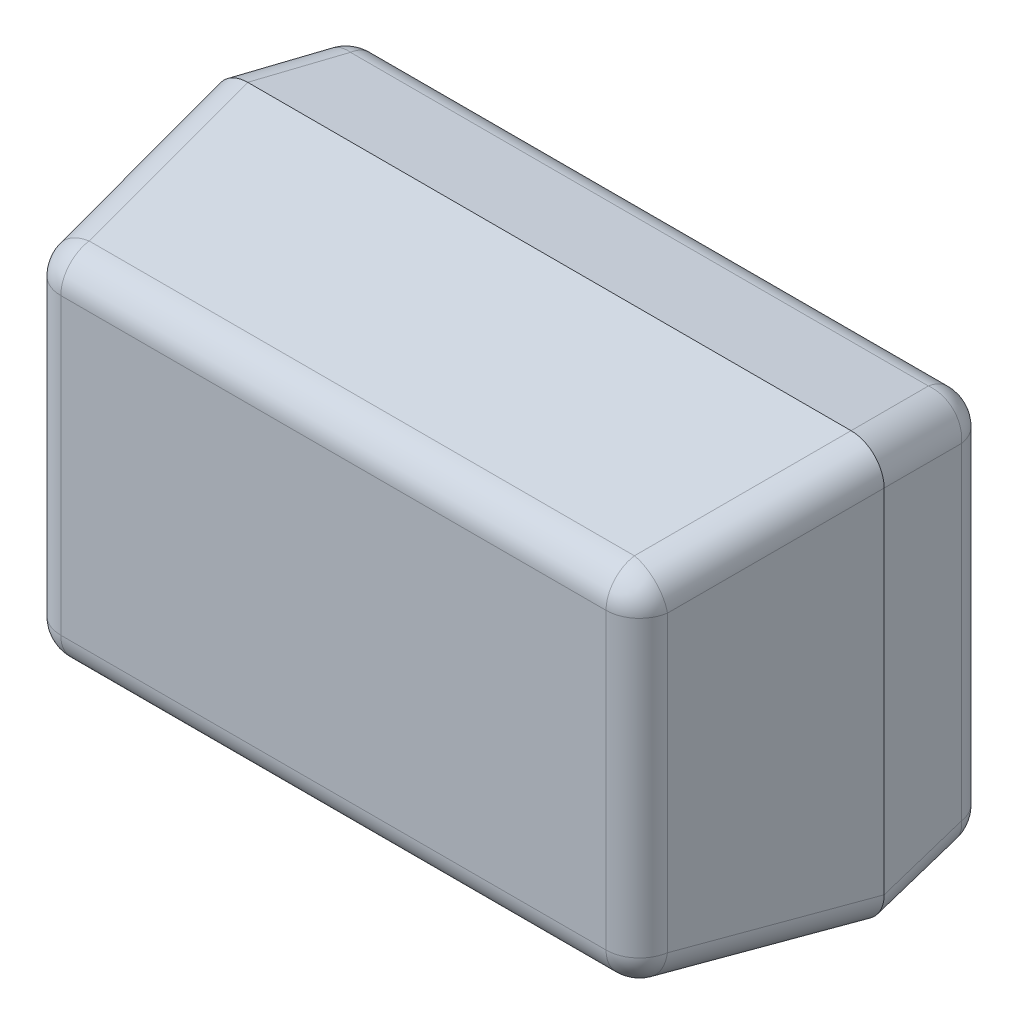
ISO-10303-21;
HEADER;
FILE_DESCRIPTION(('STEP AP214'),'2;1');
FILE_NAME('part.step','',(''),(''),'','','');
FILE_SCHEMA(('AUTOMOTIVE_DESIGN { 1 0 10303 214 1 1 1 1 }'));
ENDSEC;
DATA;
#1=APPLICATION_CONTEXT('core data for automotive mechanical design processes');
#2=APPLICATION_PROTOCOL_DEFINITION('international standard','automotive_design',2000,#1);
#3=PRODUCT_CONTEXT('',#1,'mechanical');
#4=PRODUCT('Part','Part','',(#3));
#5=PRODUCT_RELATED_PRODUCT_CATEGORY('part','',(#4));
#6=PRODUCT_DEFINITION_FORMATION('','',#4);
#7=PRODUCT_DEFINITION_CONTEXT('part definition',#1,'design');
#8=PRODUCT_DEFINITION('design','',#6,#7);
#9=PRODUCT_DEFINITION_SHAPE('','',#8);
#10=(LENGTH_UNIT() NAMED_UNIT(*) SI_UNIT(.MILLI.,.METRE.));
#11=(NAMED_UNIT(*) PLANE_ANGLE_UNIT() SI_UNIT($,.RADIAN.));
#12=(NAMED_UNIT(*) SI_UNIT($,.STERADIAN.) SOLID_ANGLE_UNIT());
#13=UNCERTAINTY_MEASURE_WITH_UNIT(LENGTH_MEASURE(1.E-05),#10,'distance_accuracy_value','');
#14=(GEOMETRIC_REPRESENTATION_CONTEXT(3) GLOBAL_UNCERTAINTY_ASSIGNED_CONTEXT((#13)) GLOBAL_UNIT_ASSIGNED_CONTEXT((#10,
#11,#12)) REPRESENTATION_CONTEXT('',''));
#15=CARTESIAN_POINT('',(0.,0.,0.));
#16=DIRECTION('',(0.,0.,1.));
#17=DIRECTION('',(1.,0.,0.));
#18=AXIS2_PLACEMENT_3D('',#15,#16,#17);
#19=CARTESIAN_POINT('',(93.000001246227,63.100000702503,-2.529022030829));
#20=DIRECTION('',(4.32841753251883E-08,0.990226517298504,-0.13946843527793));
#21=DIRECTION('',(0.,0.13946843527793,0.990226517298505));
#22=AXIS2_PLACEMENT_3D('',#19,#20,#21);
#23=PLANE('',#22);
#24=DIRECTION('',(-0.138131567174471,-0.13813146935912,-0.980734096135448));
#25=VECTOR('',#24,1.);
#26=CARTESIAN_POINT('',(94.400978596809,63.1250006257469,-2.35152202864299));
#27=LINE('',#26,#25);
#28=CARTESIAN_POINT('',(94.4010802270327,63.1250005926853,-2.35152202120412));
#29=VERTEX_POINT('',#28);
#30=CARTESIAN_POINT('',(94.3630987568167,63.0871208125789,-2.62046888413903));
#31=VERTEX_POINT('',#30);
#32=EDGE_CURVE('E131',#29,#31,#27,.T.);
#33=ORIENTED_EDGE('',*,*,#32,.T.);
#34=DIRECTION('',(0.999999999999999,-4.28611381863991E-08,6.03677620489961E-09));
#35=VECTOR('',#34,1.);
#36=CARTESIAN_POINT('',(93.000001246227,63.0871208710028,-2.62046889236769));
#37=LINE('',#36,#35);
#38=CARTESIAN_POINT('',(92.6369037299103,63.087120892633,-2.62046885148088));
#39=VERTEX_POINT('',#38);
#40=EDGE_CURVE('E150',#31,#39,#37,.F.);
#41=ORIENTED_EDGE('',*,*,#40,.T.);
#42=DIRECTION('',(-0.138131555097062,0.13813148143501,0.980734096135663));
#43=VECTOR('',#42,1.);
#44=CARTESIAN_POINT('',(92.63690373451,63.0871208880332,-2.62046888413903));
#45=LINE('',#44,#43);
#46=CARTESIAN_POINT('',(92.5989223214635,63.125000651011,-2.35152168352748));
#47=VERTEX_POINT('',#46);
#48=EDGE_CURVE('E156',#39,#47,#45,.T.);
#49=ORIENTED_EDGE('',*,*,#48,.T.);
#50=DIRECTION('',(0.999999999999999,-4.26853590619722E-08,-6.61788894724889E-09));
#51=VECTOR('',#50,1.);
#52=CARTESIAN_POINT('',(93.000001245134,63.1250006855484,-2.35152201937147));
#53=LINE('',#52,#51);
#54=EDGE_CURVE('E167',#29,#47,#53,.F.);
#55=ORIENTED_EDGE('',*,*,#54,.F.);
#56=EDGE_LOOP('',(#33,#41,#49,#55));
#57=FACE_BOUND('',#56,.T.);
#58=ADVANCED_FACE('F17',(#57),#23,.T.);
#59=CARTESIAN_POINT('',(93.000001245134,63.075000658792,-2.029022033014));
#60=DIRECTION('',(4.31953276682515E-08,0.988193894251805,0.15320844416497));
#61=DIRECTION('',(0.,-0.15320844416497,0.988193894251806));
#62=AXIS2_PLACEMENT_3D('',#59,#60,#61);
#63=PLANE('',#62);
#64=DIRECTION('',(0.151441298106237,0.151441370260255,-0.976796316844814));
#65=VECTOR('',#64,1.);
#66=CARTESIAN_POINT('',(94.31431040535,63.0381291331434,-1.79120120045993));
#67=LINE('',#66,#65);
#68=CARTESIAN_POINT('',(94.3143104053503,63.0381291331433,-1.7912012004617));
#69=VERTEX_POINT('',#68);
#70=EDGE_CURVE('E149',#69,#29,#67,.T.);
#71=ORIENTED_EDGE('',*,*,#70,.T.);
#72=ORIENTED_EDGE('',*,*,#54,.T.);
#73=DIRECTION('',(0.151441284865297,-0.151441383499723,0.976796316845041));
#74=VECTOR('',#73,1.);
#75=CARTESIAN_POINT('',(92.598820745097,63.1250005975093,-2.35152133841195));
#76=LINE('',#75,#74);
#77=CARTESIAN_POINT('',(92.6856920816944,63.0381292043322,-1.79120120045997));
#78=VERTEX_POINT('',#77);
#79=EDGE_CURVE('E138',#47,#78,#76,.T.);
#80=ORIENTED_EDGE('',*,*,#79,.T.);
#81=DIRECTION('',(0.999999999999999,-4.371138835613E-08,0.));
#82=VECTOR('',#81,1.);
#83=CARTESIAN_POINT('',(93.2500012435225,63.0381291796651,-1.79120120046004));
#84=LINE('',#83,#82);
#85=EDGE_CURVE('E171',#69,#78,#84,.F.);
#86=ORIENTED_EDGE('',*,*,#85,.F.);
#87=EDGE_LOOP('',(#71,#72,#80,#86));
#88=FACE_BOUND('',#87,.T.);
#89=ADVANCED_FACE('F170',(#88),#63,.T.);
#90=CARTESIAN_POINT('',(93.250001239203,62.93930979024,-1.806522044877));
#91=DIRECTION('',(0.999999999999999,-4.371138835613E-08,0.));
#92=DIRECTION('',(4.371138835613E-08,0.999999999999999,0.));
#93=AXIS2_PLACEMENT_3D('',#90,#91,#92);
#94=CYLINDRICAL_SURFACE('',#93,0.1);
#95=CARTESIAN_POINT('',(92.6856920773745,62.9393098149067,-1.806522044877));
#96=DIRECTION('',(0.999999999999999,-4.371138835613E-08,0.));
#97=DIRECTION('',(4.371138835613E-08,0.999999999999999,0.));
#98=AXIS2_PLACEMENT_3D('',#95,#96,#97);
#99=CIRCLE('',#98,0.1);
#100=CARTESIAN_POINT('',(92.6856920773745,62.9393098061647,-1.70652204487678));
#101=VERTEX_POINT('',#100);
#102=EDGE_CURVE('E20',#101,#78,#99,.F.);
#103=ORIENTED_EDGE('',*,*,#102,.F.);
#104=DIRECTION('',(1.,0.,0.));
#105=VECTOR('',#104,1.);
#106=CARTESIAN_POINT('',(93.50000122,62.939309806165,-1.70652204487637));
#107=LINE('',#106,#105);
#108=CARTESIAN_POINT('',(94.314310401031,62.9393097705702,-1.70652204487678));
#109=VERTEX_POINT('',#108);
#110=EDGE_CURVE('E279',#101,#109,#107,.T.);
#111=ORIENTED_EDGE('',*,*,#110,.T.);
#112=CARTESIAN_POINT('',(94.314310401031,62.9393097437176,-1.806522044877));
#113=DIRECTION('',(0.999999999999999,-4.371138835613E-08,0.));
#114=DIRECTION('',(4.371138835613E-08,0.999999999999999,0.));
#115=AXIS2_PLACEMENT_3D('',#112,#113,#114);
#116=CIRCLE('',#115,0.1);
#117=EDGE_CURVE('E280',#69,#109,#116,.T.);
#118=ORIENTED_EDGE('',*,*,#117,.F.);
#119=ORIENTED_EDGE('',*,*,#85,.T.);
#120=EDGE_LOOP('',(#103,#111,#118,#119));
#121=FACE_BOUND('',#120,.T.);
#122=ADVANCED_FACE('F308',(#121),#94,.T.);
#123=CARTESIAN_POINT('',(92.685692077375,62.939309814907,-1.806522044877));
#124=DIRECTION('',(-0.516552800872176,0.516552786330265,0.682895616361351));
#125=DIRECTION('',(-3.48612634870626E-08,-0.797537366357423,0.603269549425184));
#126=AXIS2_PLACEMENT_3D('',#123,#124,#125);
#127=SPHERICAL_SURFACE('',#126,0.1);
#128=CARTESIAN_POINT('',(92.6340367972878,62.99096509354,-1.73823248324087));
#129=VERTEX_POINT('',#128);
#130=VERTEX_LOOP('',#129);
#131=FACE_BOUND('',#130,.T.);
#132=CARTESIAN_POINT('',(92.6856920773749,62.9393098149069,-1.80652204487648));
#133=DIRECTION('',(0.151441284865984,-0.151441383499984,0.976796316844894));
#134=DIRECTION('',(0.,-0.988193893237844,-0.153208450705018));
#135=AXIS2_PLACEMENT_3D('',#132,#133,#134);
#136=CIRCLE('',#135,0.1);
#137=CARTESIAN_POINT('',(92.5868726803448,62.9393098241524,-1.79120124951079));
#138=VERTEX_POINT('',#137);
#139=EDGE_CURVE('E145',#138,#78,#136,.F.);
#140=ORIENTED_EDGE('',*,*,#139,.F.);
#141=CARTESIAN_POINT('',(92.6856920773747,62.9393098149073,-1.80652204487656));
#142=DIRECTION('',(4.37113885087798E-08,0.999999999999995,8.74227765734796E-08));
#143=DIRECTION('',(0.,-8.74227765734797E-08,0.999999999999996));
#144=AXIS2_PLACEMENT_3D('',#141,#142,#143);
#145=CIRCLE('',#144,0.1);
#146=EDGE_CURVE('E277',#101,#138,#145,.F.);
#147=ORIENTED_EDGE('',*,*,#146,.F.);
#148=ORIENTED_EDGE('',*,*,#102,.T.);
#149=EDGE_LOOP('',(#140,#147,#148));
#150=FACE_BOUND('',#149,.T.);
#151=ADVANCED_FACE('F288',(#131,#150),#127,.T.);
#152=CARTESIAN_POINT('',(94.314310401031,62.939309743718,-1.806522044877));
#153=DIRECTION('',(0.516552846030673,0.516552741172083,0.682895616361109));
#154=DIRECTION('',(-3.48613200529257E-08,-0.797537366357279,0.603269549425375));
#155=AXIS2_PLACEMENT_3D('',#152,#153,#154);
#156=SPHERICAL_SURFACE('',#155,0.1);
#157=CARTESIAN_POINT('',(94.3659656856341,62.9909650178352,-1.73823248324089));
#158=VERTEX_POINT('',#157);
#159=VERTEX_LOOP('',#158);
#160=FACE_BOUND('',#159,.T.);
#161=CARTESIAN_POINT('',(94.314310401031,62.9393097437182,-1.80652204487633));
#162=DIRECTION('',(-0.151441298105984,-0.151441370259984,0.976796316844895));
#163=DIRECTION('',(0.,-0.988193895265765,-0.153208437624936));
#164=AXIS2_PLACEMENT_3D('',#161,#162,#163);
#165=CIRCLE('',#164,0.1);
#166=CARTESIAN_POINT('',(94.4131297917955,62.939309738059,-1.79120120909891));
#167=VERTEX_POINT('',#166);
#168=EDGE_CURVE('E269',#69,#167,#165,.F.);
#169=ORIENTED_EDGE('',*,*,#168,.F.);
#170=ORIENTED_EDGE('',*,*,#117,.T.);
#171=CARTESIAN_POINT('',(94.3143104010309,62.9393097437179,-1.80652204487718));
#172=DIRECTION('',(-4.37113885087798E-08,-0.999999999999995,-8.74227765734796E-08));
#173=DIRECTION('',(0.,8.74227765734797E-08,-0.999999999999996));
#174=AXIS2_PLACEMENT_3D('',#171,#172,#173);
#175=CIRCLE('',#174,0.1);
#176=EDGE_CURVE('E263',#167,#109,#175,.T.);
#177=ORIENTED_EDGE('',*,*,#176,.F.);
#178=EDGE_LOOP('',(#169,#170,#177));
#179=FACE_BOUND('',#178,.T.);
#180=ADVANCED_FACE('F307',(#160,#179),#156,.T.);
#181=CARTESIAN_POINT('',(94.314310362625,62.060691420062,-1.806522121688));
#182=DIRECTION('',(0.516552800872387,-0.516552905730815,0.682895526044756));
#183=DIRECTION('',(-3.48612038125751E-08,-0.797537260878945,-0.603269688870333));
#184=AXIS2_PLACEMENT_3D('',#181,#182,#183);
#185=SPHERICAL_SURFACE('',#184,0.1);
#186=CARTESIAN_POINT('',(94.3659656427122,62.0090361294889,-1.73823256908353));
#187=VERTEX_POINT('',#186);
#188=VERTEX_LOOP('',#187);
#189=FACE_BOUND('',#188,.T.);
#190=CARTESIAN_POINT('',(94.3143103626255,62.0606914200623,-1.806522121688));
#191=DIRECTION('',(-0.999999999999999,4.37113884949E-08,0.));
#192=DIRECTION('',(-4.37113884949E-08,-0.999999999999999,0.));
#193=AXIS2_PLACEMENT_3D('',#190,#191,#192);
#194=CIRCLE('',#193,0.1);
#195=CARTESIAN_POINT('',(94.314310358306,61.9618720279579,-1.79120129455002));
#196=VERTEX_POINT('',#195);
#197=CARTESIAN_POINT('',(94.3143103626254,62.06069141132,-1.70652212168822));
#198=VERTEX_POINT('',#197);
#199=EDGE_CURVE('E253',#196,#198,#194,.T.);
#200=ORIENTED_EDGE('',*,*,#199,.F.);
#201=CARTESIAN_POINT('',(94.3143103626252,62.060691420062,-1.80652212168847));
#202=DIRECTION('',(0.151441284865971,-0.151441212710971,-0.976796343323814));
#203=DIRECTION('',(-0.988193908974027,0.,-0.15320834920667));
#204=AXIS2_PLACEMENT_3D('',#201,#202,#203);
#205=CIRCLE('',#204,0.1);
#206=CARTESIAN_POINT('',(94.413129748026,62.0606914197669,-1.79120125131376));
#207=VERTEX_POINT('',#206);
#208=EDGE_CURVE('E259',#207,#196,#205,.T.);
#209=ORIENTED_EDGE('',*,*,#208,.F.);
#210=CARTESIAN_POINT('',(94.3143103626253,62.0606914200623,-1.80652212168844));
#211=DIRECTION('',(-4.37113885087798E-08,-0.999999999999995,-8.74227765734796E-08));
#212=DIRECTION('',(0.,8.74227765734797E-08,-0.999999999999996));
#213=AXIS2_PLACEMENT_3D('',#210,#211,#212);
#214=CIRCLE('',#213,0.1);
#215=EDGE_CURVE('E266',#198,#207,#214,.F.);
#216=ORIENTED_EDGE('',*,*,#215,.F.);
#217=EDGE_LOOP('',(#200,#209,#216));
#218=FACE_BOUND('',#217,.T.);
#219=ADVANCED_FACE('F456',(#189,#218),#185,.T.);
#220=CARTESIAN_POINT('',(93.50000122,62.500000608742,-1.706522083282));
#221=DIRECTION('',(0.,8.74227765734797E-08,-0.999999999999996));
#222=DIRECTION('',(0.,0.999999999999996,8.74227765734797E-08));
#223=AXIS2_PLACEMENT_3D('',#220,#221,#222);
#224=PLANE('',#223);
#225=DIRECTION('',(4.37113885087798E-08,0.999999999999995,8.74227765734796E-08));
#226=VECTOR('',#225,1.);
#227=CARTESIAN_POINT('',(92.685692051342,62.3437506443367,-1.706522096942));
#228=LINE('',#227,#226);
#229=CARTESIAN_POINT('',(92.685692038969,62.0606914825089,-1.70652212168791));
#230=VERTEX_POINT('',#229);
#231=EDGE_CURVE('E273',#230,#101,#228,.T.);
#232=ORIENTED_EDGE('',*,*,#231,.F.);
#233=DIRECTION('',(-0.999999999999999,4.37113884949E-08,0.));
#234=VECTOR('',#233,1.);
#235=CARTESIAN_POINT('',(93.750001200797,62.0606914359867,-1.706522121688));
#236=LINE('',#235,#234);
#237=EDGE_CURVE('E252',#198,#230,#236,.T.);
#238=ORIENTED_EDGE('',*,*,#237,.F.);
#239=DIRECTION('',(-4.37113885087798E-08,-0.999999999999995,-8.74227765734796E-08));
#240=VECTOR('',#239,1.);
#241=CARTESIAN_POINT('',(94.3143103886581,62.6562505731477,-1.706522069623));
#242=LINE('',#241,#240);
#243=EDGE_CURVE('E262',#109,#198,#242,.T.);
#244=ORIENTED_EDGE('',*,*,#243,.F.);
#245=ORIENTED_EDGE('',*,*,#110,.F.);
#246=EDGE_LOOP('',(#232,#238,#244,#245));
#247=FACE_BOUND('',#246,.T.);
#248=ADVANCED_FACE('F294',(#247),#224,.F.);
#249=CARTESIAN_POINT('',(92.685692038969,62.060691491251,-1.806522121688));
#250=DIRECTION('',(-0.516552846030892,-0.516552860572633,0.682895526044516));
#251=DIRECTION('',(-3.48613705680734E-08,-0.797537260878801,-0.603269688870524));
#252=AXIS2_PLACEMENT_3D('',#249,#250,#251);
#253=SPHERICAL_SURFACE('',#252,0.1);
#254=CARTESIAN_POINT('',(92.6340367543659,62.0090362051937,-1.73823256908355));
#255=VERTEX_POINT('',#254);
#256=VERTEX_LOOP('',#255);
#257=FACE_BOUND('',#256,.T.);
#258=CARTESIAN_POINT('',(92.6856920389691,62.0606914912509,-1.80652212168782));
#259=DIRECTION('',(4.37113885087798E-08,0.999999999999995,8.74227765734796E-08));
#260=DIRECTION('',(0.,-8.74227765734797E-08,0.999999999999996));
#261=AXIS2_PLACEMENT_3D('',#258,#259,#260);
#262=CIRCLE('',#261,0.1);
#263=CARTESIAN_POINT('',(92.5868726482043,62.060691494231,-1.79120128591084));
#264=VERTEX_POINT('',#263);
#265=EDGE_CURVE('E274',#264,#230,#262,.T.);
#266=ORIENTED_EDGE('',*,*,#265,.F.);
#267=CARTESIAN_POINT('',(92.6856920389688,62.0606914912513,-1.80652212168831));
#268=DIRECTION('',(0.151441298105948,0.151441199471948,0.976796343323665));
#269=DIRECTION('',(0.988193906946107,0.,-0.153208362286752));
#270=AXIS2_PLACEMENT_3D('',#267,#268,#269);
#271=CIRCLE('',#270,0.1);
#272=CARTESIAN_POINT('',(92.6856920340185,61.9618720983067,-1.79120129996987));
#273=VERTEX_POINT('',#272);
#274=EDGE_CURVE('E248',#273,#264,#271,.F.);
#275=ORIENTED_EDGE('',*,*,#274,.F.);
#276=CARTESIAN_POINT('',(92.685692038969,62.0606914912514,-1.806522121688));
#277=DIRECTION('',(-0.999999999999999,4.37113884949E-08,0.));
#278=DIRECTION('',(-4.37113884949E-08,-0.999999999999999,0.));
#279=AXIS2_PLACEMENT_3D('',#276,#277,#278);
#280=CIRCLE('',#279,0.1);
#281=EDGE_CURVE('E256',#230,#273,#280,.F.);
#282=ORIENTED_EDGE('',*,*,#281,.F.);
#283=EDGE_LOOP('',(#266,#275,#282));
#284=FACE_BOUND('',#283,.T.);
#285=ADVANCED_FACE('F450',(#257,#284),#253,.T.);
#286=CARTESIAN_POINT('',(92.685692051342,62.343750653079,-1.806522096942));
#287=DIRECTION('',(4.37113885087798E-08,0.999999999999995,8.74227765734796E-08));
#288=DIRECTION('',(0.,-8.74227765734797E-08,0.999999999999996));
#289=AXIS2_PLACEMENT_3D('',#286,#287,#288);
#290=CYLINDRICAL_SURFACE('',#289,0.1);
#291=ORIENTED_EDGE('',*,*,#265,.T.);
#292=ORIENTED_EDGE('',*,*,#231,.T.);
#293=ORIENTED_EDGE('',*,*,#146,.T.);
#294=DIRECTION('',(2.94495893794284E-08,1.,-4.56582781077679E-09));
#295=VECTOR('',#294,1.);
#296=CARTESIAN_POINT('',(92.5868726519389,62.187500678462,-1.7912012864899));
#297=LINE('',#296,#295);
#298=EDGE_CURVE('E432',#264,#138,#297,.T.);
#299=ORIENTED_EDGE('',*,*,#298,.F.);
#300=EDGE_LOOP('',(#291,#292,#293,#299));
#301=FACE_BOUND('',#300,.T.);
#302=ADVANCED_FACE('F298',(#301),#290,.T.);
#303=CARTESIAN_POINT('',(92.661891684485,62.963110223298,-1.960034583646));
#304=DIRECTION('',(0.151441284865984,-0.151441383499984,0.976796316844894));
#305=DIRECTION('',(0.,-0.988193893237844,-0.153208450705018));
#306=AXIS2_PLACEMENT_3D('',#303,#304,#305);
#307=CYLINDRICAL_SURFACE('',#306,0.1);
#308=ORIENTED_EDGE('',*,*,#79,.F.);
#309=CARTESIAN_POINT('',(92.6010871157439,63.0239148316411,-2.35222406385379));
#310=DIRECTION('',(0.00679893114821805,-0.00679901916117259,0.99995377286837));
#311=DIRECTION('',(-0.707074063180194,0.707074124156402,0.00961520287401047));
#312=AXIS2_PLACEMENT_3D('',#309,#310,#311);
#313=ELLIPSE('',#312,0.10216482627678,0.1);
#314=CARTESIAN_POINT('',(92.5000012823391,63.0260796822685,-2.35152207448449));
#315=VERTEX_POINT('',#314);
#316=EDGE_CURVE('E143',#315,#47,#313,.F.);
#317=ORIENTED_EDGE('',*,*,#316,.F.);
#318=DIRECTION('',(-0.151441284866614,0.151441383500822,-0.976796316844666));
#319=VECTOR('',#318,1.);
#320=CARTESIAN_POINT('',(92.5868726866101,62.939309817887,-1.79120120909902));
#321=LINE('',#320,#319);
#322=EDGE_CURVE('E162',#138,#315,#321,.T.);
#323=ORIENTED_EDGE('',*,*,#322,.F.);
#324=ORIENTED_EDGE('',*,*,#139,.T.);
#325=EDGE_LOOP('',(#308,#317,#323,#324));
#326=FACE_BOUND('',#325,.T.);
#327=ADVANCED_FACE('F140',(#326),#307,.T.);
#328=CARTESIAN_POINT('',(94.33381058367,62.958809935648,-1.932298215695));
#329=DIRECTION('',(-0.151441298105984,-0.151441370259984,0.976796316844895));
#330=DIRECTION('',(0.,-0.988193895265765,-0.153208437624936));
#331=AXIS2_PLACEMENT_3D('',#328,#329,#330);
#332=CYLINDRICAL_SURFACE('',#331,0.1);
#333=DIRECTION('',(-0.151441298106074,-0.151441370259986,0.976796316844881));
#334=VECTOR('',#333,1.);
#335=CARTESIAN_POINT('',(94.5000011359878,63.026181123641,-2.35152134705088));
#336=LINE('',#335,#334);
#337=CARTESIAN_POINT('',(94.5000011894896,63.0260795472745,-2.35152169217551));
#338=VERTEX_POINT('',#337);
#339=EDGE_CURVE('E414',#338,#167,#336,.T.);
#340=ORIENTED_EDGE('',*,*,#339,.F.);
#341=CARTESIAN_POINT('',(94.3989153700587,63.0239147530558,-2.35222406385404));
#342=DIRECTION('',(0.0067989317428175,0.00679901856657348,-0.99995377286837));
#343=DIRECTION('',(-0.707074124996375,-0.707074062340221,-0.00961520287400559));
#344=AXIS2_PLACEMENT_3D('',#341,#342,#343);
#345=ELLIPSE('',#344,0.10216482627678,0.1);
#346=EDGE_CURVE('E161',#29,#338,#345,.T.);
#347=ORIENTED_EDGE('',*,*,#346,.F.);
#348=ORIENTED_EDGE('',*,*,#70,.F.);
#349=ORIENTED_EDGE('',*,*,#168,.T.);
#350=EDGE_LOOP('',(#340,#347,#348,#349));
#351=FACE_BOUND('',#350,.T.);
#352=ADVANCED_FACE('F568',(#351),#332,.T.);
#353=CARTESIAN_POINT('',(94.314310388658,62.65625058189,-1.806522069623));
#354=DIRECTION('',(-4.37113885087798E-08,-0.999999999999995,-8.74227765734796E-08));
#355=DIRECTION('',(0.,8.74227765734797E-08,-0.999999999999996));
#356=AXIS2_PLACEMENT_3D('',#353,#354,#355);
#357=CYLINDRICAL_SURFACE('',#356,0.1);
#358=ORIENTED_EDGE('',*,*,#176,.T.);
#359=ORIENTED_EDGE('',*,*,#243,.T.);
#360=ORIENTED_EDGE('',*,*,#215,.T.);
#361=DIRECTION('',(5.59211301997372E-08,0.999999999999999,8.66994266665005E-09));
#362=VECTOR('',#361,1.);
#363=CARTESIAN_POINT('',(94.4131297847041,62.81250059541,-1.79120121019836));
#364=LINE('',#363,#362);
#365=EDGE_CURVE('E239',#167,#207,#364,.F.);
#366=ORIENTED_EDGE('',*,*,#365,.F.);
#367=EDGE_LOOP('',(#358,#359,#360,#366));
#368=FACE_BOUND('',#367,.T.);
#369=ADVANCED_FACE('F535',(#368),#357,.T.);
#370=CARTESIAN_POINT('',(94.338110755515,62.036891038512,-1.960034664619));
#371=DIRECTION('',(0.151441284865971,-0.151441212710971,-0.976796343323814));
#372=DIRECTION('',(-0.988193908974027,0.,-0.15320834920667));
#373=AXIS2_PLACEMENT_3D('',#370,#371,#372);
#374=CYLINDRICAL_SURFACE('',#373,0.1);
#375=DIRECTION('',(-0.151441284865593,0.151441212711474,0.976796343323795));
#376=VECTOR('',#375,1.);
#377=CARTESIAN_POINT('',(94.401181694903,61.8750007327504,-2.3515214476899));
#378=LINE('',#377,#376);
#379=CARTESIAN_POINT('',(94.4010801185365,61.875000679249,-2.35152179280598));
#380=VERTEX_POINT('',#379);
#381=EDGE_CURVE('E401',#380,#196,#378,.T.);
#382=ORIENTED_EDGE('',*,*,#381,.F.);
#383=CARTESIAN_POINT('',(94.398915324256,61.9760864987414,-2.35222415545872));
#384=DIRECTION('',(0.00679893114819009,-0.00679884432341249,-0.999953774057135));
#385=DIRECTION('',(-0.707074063180805,0.707074125836959,-0.00961507924501987));
#386=AXIS2_PLACEMENT_3D('',#383,#384,#385);
#387=ELLIPSE('',#386,0.102164826276776,0.1);
#388=CARTESIAN_POINT('',(94.5000011703617,61.9739216352906,-2.35152207629137));
#389=VERTEX_POINT('',#388);
#390=EDGE_CURVE('E235',#389,#380,#387,.T.);
#391=ORIENTED_EDGE('',*,*,#390,.F.);
#392=DIRECTION('',(0.151441284866627,-0.151441212711714,-0.976796343323597));
#393=VECTOR('',#392,1.);
#394=CARTESIAN_POINT('',(94.41312975339,62.060691414403,-1.79120128591101));
#395=LINE('',#394,#393);
#396=EDGE_CURVE('E243',#207,#389,#395,.T.);
#397=ORIENTED_EDGE('',*,*,#396,.F.);
#398=ORIENTED_EDGE('',*,*,#208,.T.);
#399=EDGE_LOOP('',(#382,#391,#397,#398));
#400=FACE_BOUND('',#399,.T.);
#401=ADVANCED_FACE('F469',(#400),#374,.T.);
#402=CARTESIAN_POINT('',(93.750001200797,62.060691444729,-1.806522121688));
#403=DIRECTION('',(-0.999999999999999,4.37113884949E-08,0.));
#404=DIRECTION('',(-4.37113884949E-08,-0.999999999999999,0.));
#405=AXIS2_PLACEMENT_3D('',#402,#403,#404);
#406=CYLINDRICAL_SURFACE('',#405,0.1);
#407=ORIENTED_EDGE('',*,*,#199,.T.);
#408=ORIENTED_EDGE('',*,*,#237,.T.);
#409=ORIENTED_EDGE('',*,*,#281,.T.);
#410=DIRECTION('',(0.999999999999999,-4.26853603545886E-08,6.61788150492472E-09));
#411=VECTOR('',#410,1.);
#412=CARTESIAN_POINT('',(94.000001194866,61.961872041374,-1.79120129662999));
#413=LINE('',#412,#411);
#414=EDGE_CURVE('E232',#196,#273,#413,.F.);
#415=ORIENTED_EDGE('',*,*,#414,.F.);
#416=EDGE_LOOP('',(#407,#408,#409,#415));
#417=FACE_BOUND('',#416,.T.);
#418=ADVANCED_FACE('F472',(#417),#406,.T.);
#419=CARTESIAN_POINT('',(92.66619185633,62.041191321313,-1.932298295915));
#420=DIRECTION('',(0.151441298105948,0.151441199471948,0.976796343323665));
#421=DIRECTION('',(0.988193906946107,0.,-0.153208362286752));
#422=AXIS2_PLACEMENT_3D('',#419,#420,#421);
#423=CYLINDRICAL_SURFACE('',#422,0.1);
#424=DIRECTION('',(0.151441298106039,0.151441199472604,0.976796343323549));
#425=VECTOR('',#424,1.);
#426=CARTESIAN_POINT('',(92.5000013040123,61.973820206618,-2.35152143905089));
#427=LINE('',#426,#425);
#428=CARTESIAN_POINT('',(92.5000012505104,61.973921782985,-2.35152178415801));
#429=VERTEX_POINT('',#428);
#430=EDGE_CURVE('E251',#429,#264,#427,.T.);
#431=ORIENTED_EDGE('',*,*,#430,.F.);
#432=CARTESIAN_POINT('',(92.6010870699412,61.9760865773272,-2.35222415545756));
#433=DIRECTION('',(-0.006798931742778,-0.00679884372931264,-0.999953774057132));
#434=DIRECTION('',(0.707074124995762,0.707074064021997,-0.00961507924536997));
#435=AXIS2_PLACEMENT_3D('',#432,#433,#434);
#436=ELLIPSE('',#435,0.102164826276784,0.1);
#437=CARTESIAN_POINT('',(92.5989222125842,61.8750007371918,-2.35152212776356));
#438=VERTEX_POINT('',#437);
#439=EDGE_CURVE('E228',#438,#429,#436,.T.);
#440=ORIENTED_EDGE('',*,*,#439,.F.);
#441=DIRECTION('',(-0.151441298106275,-0.15144119947203,-0.976796343323601));
#442=VECTOR('',#441,1.);
#443=CARTESIAN_POINT('',(92.68569203465,61.9618720991467,-1.79120129454996));
#444=LINE('',#443,#442);
#445=EDGE_CURVE('E238',#273,#438,#444,.T.);
#446=ORIENTED_EDGE('',*,*,#445,.F.);
#447=ORIENTED_EDGE('',*,*,#274,.T.);
#448=EDGE_LOOP('',(#431,#440,#446,#447));
#449=FACE_BOUND('',#448,.T.);
#450=ADVANCED_FACE('F540',(#449),#423,.T.);
#451=CARTESIAN_POINT('',(92.55000120634,62.187500678462,-2.029022110602));
#452=DIRECTION('',(-0.988193907645613,2.98014277881883E-08,0.15320835777494));
#453=DIRECTION('',(0.15320835777494,0.,0.988193907645613));
#454=AXIS2_PLACEMENT_3D('',#451,#452,#453);
#455=PLANE('',#454);
#456=ORIENTED_EDGE('',*,*,#322,.T.);
#457=DIRECTION('',(5.49346976930323E-08,0.999999999999998,7.73728136522051E-09));
#458=VECTOR('',#457,1.);
#459=CARTESIAN_POINT('',(92.5000012087359,62.187500723266,-2.35152212761332));
#460=LINE('',#459,#458);
#461=EDGE_CURVE('E394',#429,#315,#460,.T.);
#462=ORIENTED_EDGE('',*,*,#461,.F.);
#463=ORIENTED_EDGE('',*,*,#430,.T.);
#464=ORIENTED_EDGE('',*,*,#298,.T.);
#465=EDGE_LOOP('',(#456,#462,#463,#464));
#466=FACE_BOUND('',#465,.T.);
#467=ADVANCED_FACE('F556',(#466),#455,.T.);
#468=CARTESIAN_POINT('',(92.63537148492,62.989630480748,-2.595643098642));
#469=DIRECTION('',(-0.138131555096956,0.138131481434956,0.980734096135686));
#470=DIRECTION('',(0.990226506184988,0.,0.139468514183924));
#471=AXIS2_PLACEMENT_3D('',#468,#469,#470);
#472=CYLINDRICAL_SURFACE('',#471,0.1);
#473=DIRECTION('',(0.138131555097315,-0.138131481436275,-0.98073409613545));
#474=VECTOR('',#473,1.);
#475=CARTESIAN_POINT('',(92.500001242991,63.025978058331,-2.3515220373));
#476=LINE('',#475,#474);
#477=CARTESIAN_POINT('',(92.5378810796714,62.988098241851,-2.62046889279599));
#478=VERTEX_POINT('',#477);
#479=EDGE_CURVE('E159',#315,#478,#476,.T.);
#480=ORIENTED_EDGE('',*,*,#479,.F.);
#481=ORIENTED_EDGE('',*,*,#316,.T.);
#482=ORIENTED_EDGE('',*,*,#48,.F.);
#483=CARTESIAN_POINT('',(92.6369037301819,62.9880982363032,-2.60652204061117));
#484=DIRECTION('',(-0.138131555096956,0.138131481434956,0.980734096135686));
#485=DIRECTION('',(0.990226506184988,0.,0.139468514183924));
#486=AXIS2_PLACEMENT_3D('',#483,#484,#485);
#487=CIRCLE('',#486,0.1);
#488=EDGE_CURVE('E225',#478,#39,#487,.F.);
#489=ORIENTED_EDGE('',*,*,#488,.F.);
#490=EDGE_LOOP('',(#480,#481,#482,#489));
#491=FACE_BOUND('',#490,.T.);
#492=ADVANCED_FACE('F155',(#491),#472,.T.);
#493=CARTESIAN_POINT('',(94.361053436195,62.986052846003,-2.621043785846));
#494=DIRECTION('',(-0.138131567172956,-0.138131469358956,-0.980734096135685));
#495=DIRECTION('',(-0.990226504501085,0.,0.139468526139637));
#496=AXIS2_PLACEMENT_3D('',#493,#494,#495);
#497=CYLINDRICAL_SURFACE('',#496,0.1);
#498=ORIENTED_EDGE('',*,*,#32,.F.);
#499=ORIENTED_EDGE('',*,*,#346,.T.);
#500=DIRECTION('',(0.138131567173223,0.138131469358935,0.98073409613565));
#501=VECTOR('',#500,1.);
#502=CARTESIAN_POINT('',(94.4621214029998,62.98809815774,-2.62046889279597));
#503=LINE('',#502,#501);
#504=CARTESIAN_POINT('',(94.4621214029993,62.9880981577396,-2.62046889279738));
#505=VERTEX_POINT('',#504);
#506=EDGE_CURVE('E425',#505,#338,#503,.T.);
#507=ORIENTED_EDGE('',*,*,#506,.F.);
#508=CARTESIAN_POINT('',(94.3630987524894,62.9880981608491,-2.60652204061143));
#509=DIRECTION('',(-0.138131567172956,-0.138131469358956,-0.980734096135685));
#510=DIRECTION('',(-0.990226504501085,0.,0.139468526139637));
#511=AXIS2_PLACEMENT_3D('',#508,#509,#510);
#512=CIRCLE('',#511,0.1);
#513=EDGE_CURVE('E221',#31,#505,#512,.T.);
#514=ORIENTED_EDGE('',*,*,#513,.F.);
#515=EDGE_LOOP('',(#498,#499,#507,#514));
#516=FACE_BOUND('',#515,.T.);
#517=ADVANCED_FACE('F500',(#516),#497,.T.);
#518=CARTESIAN_POINT('',(94.45000123366,62.81250059541,-2.029022055963));
#519=DIRECTION('',(0.988193907645611,-5.65892278499977E-08,0.15320835777494));
#520=DIRECTION('',(0.15320835777494,0.,-0.988193907645613));
#521=AXIS2_PLACEMENT_3D('',#518,#519,#520);
#522=PLANE('',#521);
#523=ORIENTED_EDGE('',*,*,#339,.T.);
#524=ORIENTED_EDGE('',*,*,#365,.T.);
#525=ORIENTED_EDGE('',*,*,#396,.T.);
#526=DIRECTION('',(3.07875779236688E-08,1.,-4.33627858080105E-09));
#527=VECTOR('',#526,1.);
#528=CARTESIAN_POINT('',(94.500001236419,62.812500638029,-2.35152203637436));
#529=LINE('',#528,#527);
#530=EDGE_CURVE('E220',#338,#389,#529,.F.);
#531=ORIENTED_EDGE('',*,*,#530,.F.);
#532=EDGE_LOOP('',(#523,#524,#525,#531));
#533=FACE_BOUND('',#532,.T.);
#534=ADVANCED_FACE('F532',(#533),#522,.T.);
#535=CARTESIAN_POINT('',(94.36463095508,62.010370892195,-2.595643184251));
#536=DIRECTION('',(-0.138131555096998,0.138131652911998,-0.980734071983983));
#537=DIRECTION('',(0.,0.990226492071113,0.13946861439241));
#538=AXIS2_PLACEMENT_3D('',#535,#536,#537);
#539=CYLINDRICAL_SURFACE('',#538,0.1);
#540=DIRECTION('',(-0.138131555097366,0.138131652912641,-0.980734071983841));
#541=VECTOR('',#540,1.);
#542=CARTESIAN_POINT('',(94.500001197009,61.974023271929,-2.351522129265));
#543=LINE('',#542,#541);
#544=CARTESIAN_POINT('',(94.4621213603286,62.011903135433,-2.62046897813783));
#545=VERTEX_POINT('',#544);
#546=EDGE_CURVE('E224',#389,#545,#543,.T.);
#547=ORIENTED_EDGE('',*,*,#546,.F.);
#548=ORIENTED_EDGE('',*,*,#390,.T.);
#549=DIRECTION('',(0.138131555096962,-0.138131652911402,0.980734071984072));
#550=VECTOR('',#549,1.);
#551=CARTESIAN_POINT('',(94.36309870549,61.9128804892509,-2.62046898679501));
#552=LINE('',#551,#550);
#553=CARTESIAN_POINT('',(94.3630987054896,61.912880489251,-2.6204689867965));
#554=VERTEX_POINT('',#553);
#555=EDGE_CURVE('E357',#554,#380,#552,.T.);
#556=ORIENTED_EDGE('',*,*,#555,.F.);
#557=CARTESIAN_POINT('',(94.3630987098179,62.0119031385421,-2.60652212595349));
#558=DIRECTION('',(-0.138131555096998,0.138131652911998,-0.980734071983983));
#559=DIRECTION('',(0.,0.990226492071113,0.13946861439241));
#560=AXIS2_PLACEMENT_3D('',#557,#558,#559);
#561=CIRCLE('',#560,0.1);
#562=EDGE_CURVE('E217',#545,#554,#561,.T.);
#563=ORIENTED_EDGE('',*,*,#562,.F.);
#564=EDGE_LOOP('',(#547,#548,#556,#563));
#565=FACE_BOUND('',#564,.T.);
#566=ADVANCED_FACE('F484',(#565),#539,.T.);
#567=CARTESIAN_POINT('',(94.000001194866,61.92500061508,-2.029022133551));
#568=DIRECTION('',(-4.31953278053809E-08,-0.988193921039563,0.153208271383932));
#569=DIRECTION('',(0.,-0.153208271383932,-0.988193921039564));
#570=AXIS2_PLACEMENT_3D('',#567,#568,#569);
#571=PLANE('',#570);
#572=ORIENTED_EDGE('',*,*,#381,.T.);
#573=ORIENTED_EDGE('',*,*,#414,.T.);
#574=ORIENTED_EDGE('',*,*,#445,.T.);
#575=DIRECTION('',(0.999999999999999,-4.28611372670031E-08,-6.03678371812211E-09));
#576=VECTOR('',#575,1.);
#577=CARTESIAN_POINT('',(94.000001193773,61.8750006429336,-2.35152213550135));
#578=LINE('',#577,#576);
#579=EDGE_CURVE('E216',#380,#438,#578,.F.);
#580=ORIENTED_EDGE('',*,*,#579,.F.);
#581=EDGE_LOOP('',(#572,#573,#574,#580));
#582=FACE_BOUND('',#581,.T.);
#583=ADVANCED_FACE('F476',(#582),#571,.T.);
#584=CARTESIAN_POINT('',(92.638949003805,62.013948531382,-2.62104387083));
#585=DIRECTION('',(0.138131567172998,0.138131640835998,-0.980734071983984));
#586=DIRECTION('',(0.,0.990226493755017,0.139468602436697));
#587=AXIS2_PLACEMENT_3D('',#584,#585,#586);
#588=CYLINDRICAL_SURFACE('',#587,0.1);
#589=DIRECTION('',(0.138131567174373,0.138131640835513,-0.980734071983859));
#590=VECTOR('',#589,1.);
#591=CARTESIAN_POINT('',(92.599023843191,61.8750007045132,-2.35152213792197));
#592=LINE('',#591,#590);
#593=CARTESIAN_POINT('',(92.636903683183,61.9128805647052,-2.62046898679488));
#594=VERTEX_POINT('',#593);
#595=EDGE_CURVE('E219',#438,#594,#592,.T.);
#596=ORIENTED_EDGE('',*,*,#595,.F.);
#597=ORIENTED_EDGE('',*,*,#439,.T.);
#598=DIRECTION('',(-0.138131567173177,-0.138131640835254,0.980734071984064));
#599=VECTOR('',#598,1.);
#600=CARTESIAN_POINT('',(92.5378810370003,62.011903219544,-2.62046897813796));
#601=LINE('',#600,#599);
#602=CARTESIAN_POINT('',(92.5378810370008,62.0119032195444,-2.62046897813938));
#603=VERTEX_POINT('',#602);
#604=EDGE_CURVE('E231',#603,#429,#601,.T.);
#605=ORIENTED_EDGE('',*,*,#604,.F.);
#606=CARTESIAN_POINT('',(92.6369036875106,62.0119032139969,-2.60652212595334));
#607=DIRECTION('',(0.138131567172998,0.138131640835998,-0.980734071983984));
#608=DIRECTION('',(0.,0.990226493755017,0.139468602436697));
#609=AXIS2_PLACEMENT_3D('',#606,#607,#608);
#610=CIRCLE('',#609,0.1);
#611=EDGE_CURVE('E213',#594,#603,#610,.T.);
#612=ORIENTED_EDGE('',*,*,#611,.F.);
#613=EDGE_LOOP('',(#596,#597,#605,#612));
#614=FACE_BOUND('',#613,.T.);
#615=ADVANCED_FACE('F520',(#614),#588,.T.);
#616=CARTESIAN_POINT('',(92.52500120634,62.187500723266,-2.529022110602));
#617=DIRECTION('',(-0.990226505105825,5.54769009007302E-08,-0.139468521845975));
#618=DIRECTION('',(-0.139468521845976,0.,0.990226505105826));
#619=AXIS2_PLACEMENT_3D('',#616,#617,#618);
#620=PLANE('',#619);
#621=ORIENTED_EDGE('',*,*,#479,.T.);
#622=DIRECTION('',(-4.37113885087798E-08,-0.999999999999995,-8.74227765734796E-08));
#623=VECTOR('',#622,1.);
#624=CARTESIAN_POINT('',(92.5378810515064,62.3437507306977,-2.62046894912684));
#625=LINE('',#624,#623);
#626=EDGE_CURVE('E209',#603,#478,#625,.F.);
#627=ORIENTED_EDGE('',*,*,#626,.F.);
#628=ORIENTED_EDGE('',*,*,#604,.T.);
#629=ORIENTED_EDGE('',*,*,#461,.T.);
#630=EDGE_LOOP('',(#621,#627,#628,#629));
#631=FACE_BOUND('',#630,.T.);
#632=ADVANCED_FACE('F512',(#631),#620,.T.);
#633=CARTESIAN_POINT('',(92.636903730182,62.988098236304,-2.606522040612));
#634=DIRECTION('',(-0.522128945562991,0.522129050162895,-0.674360896835865));
#635=DIRECTION('',(3.45623358821712E-08,0.790699204085784,0.612204842073392));
#636=AXIS2_PLACEMENT_3D('',#633,#634,#635);
#637=SPHERICAL_SURFACE('',#636,0.1);
#638=CARTESIAN_POINT('',(92.5846908356257,63.0403111413203,-2.67395813029558));
#639=VERTEX_POINT('',#638);
#640=VERTEX_LOOP('',#639);
#641=FACE_BOUND('',#640,.T.);
#642=CARTESIAN_POINT('',(92.6369037301823,62.9880982363033,-2.60652204061135));
#643=DIRECTION('',(-4.37113885087798E-08,-0.999999999999995,-8.74227765734796E-08));
#644=DIRECTION('',(0.,8.74227765734797E-08,-0.999999999999996));
#645=AXIS2_PLACEMENT_3D('',#642,#643,#644);
#646=CIRCLE('',#645,0.1);
#647=CARTESIAN_POINT('',(92.6369037088467,62.9880982450458,-2.70652204061116));
#648=VERTEX_POINT('',#647);
#649=EDGE_CURVE('E206',#478,#648,#646,.T.);
#650=ORIENTED_EDGE('',*,*,#649,.F.);
#651=ORIENTED_EDGE('',*,*,#488,.T.);
#652=CARTESIAN_POINT('',(92.6369037195144,62.9880982363033,-2.606522040612));
#653=DIRECTION('',(-0.999999999999999,4.371138835613E-08,0.));
#654=DIRECTION('',(-4.371138835613E-08,-0.999999999999999,0.));
#655=AXIS2_PLACEMENT_3D('',#652,#653,#654);
#656=CIRCLE('',#655,0.1);
#657=EDGE_CURVE('E204',#648,#39,#656,.F.);
#658=ORIENTED_EDGE('',*,*,#657,.F.);
#659=EDGE_LOOP('',(#650,#651,#658));
#660=FACE_BOUND('',#659,.T.);
#661=ADVANCED_FACE('F379',(#641,#660),#637,.T.);
#662=CARTESIAN_POINT('',(94.363098752489,62.988098160849,-2.606522040612));
#663=DIRECTION('',(0.52212899120912,0.522129004516849,-0.674360896835805));
#664=DIRECTION('',(3.45628249354135E-08,0.790699204085789,0.612204842073386));
#665=AXIS2_PLACEMENT_3D('',#662,#663,#664);
#666=SPHERICAL_SURFACE('',#665,0.1);
#667=CARTESIAN_POINT('',(94.4153116516099,63.0403110613007,-2.67395813029558));
#668=VERTEX_POINT('',#667);
#669=VERTEX_LOOP('',#668);
#670=FACE_BOUND('',#669,.T.);
#671=ORIENTED_EDGE('',*,*,#513,.T.);
#672=CARTESIAN_POINT('',(94.3630987524885,62.9880981608487,-2.60652204061197));
#673=DIRECTION('',(4.37113885087798E-08,0.999999999999995,8.74227765734796E-08));
#674=DIRECTION('',(0.,-8.74227765734797E-08,0.999999999999996));
#675=AXIS2_PLACEMENT_3D('',#672,#673,#674);
#676=CIRCLE('',#675,0.1);
#677=CARTESIAN_POINT('',(94.3630987524888,62.9880982073185,-2.70652204061157));
#678=VERTEX_POINT('',#677);
#679=EDGE_CURVE('E198',#678,#505,#676,.F.);
#680=ORIENTED_EDGE('',*,*,#679,.F.);
#681=CARTESIAN_POINT('',(94.3630987524886,62.988098160849,-2.606522040612));
#682=DIRECTION('',(-0.999999999999999,4.371138835613E-08,0.));
#683=DIRECTION('',(-4.371138835613E-08,-0.999999999999999,0.));
#684=AXIS2_PLACEMENT_3D('',#681,#682,#683);
#685=CIRCLE('',#684,0.1);
#686=EDGE_CURVE('E201',#31,#678,#685,.T.);
#687=ORIENTED_EDGE('',*,*,#686,.F.);
#688=EDGE_LOOP('',(#671,#680,#687));
#689=FACE_BOUND('',#688,.T.);
#690=ADVANCED_FACE('F374',(#670,#689),#666,.T.);
#691=CARTESIAN_POINT('',(94.47500123366,62.812500638029,-2.529022055963));
#692=DIRECTION('',(0.990226505105826,-3.10914500520045E-08,-0.139468521845975));
#693=DIRECTION('',(-0.139468521845976,0.,-0.990226505105826));
#694=AXIS2_PLACEMENT_3D('',#691,#692,#693);
#695=PLANE('',#694);
#696=ORIENTED_EDGE('',*,*,#506,.T.);
#697=ORIENTED_EDGE('',*,*,#530,.T.);
#698=ORIENTED_EDGE('',*,*,#546,.T.);
#699=DIRECTION('',(4.37113885087798E-08,0.999999999999995,8.74227765734796E-08));
#700=VECTOR('',#699,1.);
#701=CARTESIAN_POINT('',(94.4621213884937,62.6562506465868,-2.62046892180692));
#702=LINE('',#701,#700);
#703=EDGE_CURVE('E197',#505,#545,#702,.F.);
#704=ORIENTED_EDGE('',*,*,#703,.F.);
#705=EDGE_LOOP('',(#696,#697,#698,#704));
#706=FACE_BOUND('',#705,.T.);
#707=ADVANCED_FACE('F370',(#706),#695,.T.);
#708=CARTESIAN_POINT('',(94.363098709818,62.011903138542,-2.606522125953));
#709=DIRECTION('',(0.522128945562551,-0.522128932254507,-0.674360988127655));
#710=DIRECTION('',(3.4562821438211E-08,0.790699311126831,-0.612204703823446));
#711=AXIS2_PLACEMENT_3D('',#708,#709,#710);
#712=SPHERICAL_SURFACE('',#711,0.1);
#713=CARTESIAN_POINT('',(94.4153116043743,61.9596902453166,-2.67395822476577));
#714=VERTEX_POINT('',#713);
#715=VERTEX_LOOP('',#714);
#716=FACE_BOUND('',#715,.T.);
#717=ORIENTED_EDGE('',*,*,#562,.T.);
#718=CARTESIAN_POINT('',(94.363098709818,62.0119031385417,-2.606522125953));
#719=DIRECTION('',(0.999999999999999,-4.37113884949E-08,0.));
#720=DIRECTION('',(4.37113884949E-08,0.999999999999999,0.));
#721=AXIS2_PLACEMENT_3D('',#718,#719,#720);
#722=CIRCLE('',#721,0.1);
#723=CARTESIAN_POINT('',(94.3630987311533,62.0119031472842,-2.70652212595284));
#724=VERTEX_POINT('',#723);
#725=EDGE_CURVE('E35',#724,#554,#722,.F.);
#726=ORIENTED_EDGE('',*,*,#725,.F.);
#727=CARTESIAN_POINT('',(94.3630987098177,62.0119031385422,-2.60652212595365));
#728=DIRECTION('',(4.37113885087798E-08,0.999999999999995,8.74227765734796E-08));
#729=DIRECTION('',(0.,-8.74227765734797E-08,0.999999999999996));
#730=AXIS2_PLACEMENT_3D('',#727,#728,#729);
#731=CIRCLE('',#730,0.1);
#732=EDGE_CURVE('E195',#545,#724,#731,.T.);
#733=ORIENTED_EDGE('',*,*,#732,.F.);
#734=EDGE_LOOP('',(#717,#726,#733));
#735=FACE_BOUND('',#734,.T.);
#736=ADVANCED_FACE('F367',(#716,#735),#712,.T.);
#737=CARTESIAN_POINT('',(94.000001193773,61.900000658792,-2.529022135736));
#738=DIRECTION('',(-4.32841754626361E-08,-0.990226492913139,-0.13946860841402));
#739=DIRECTION('',(0.,0.13946860841402,-0.99022649291314));
#740=AXIS2_PLACEMENT_3D('',#737,#738,#739);
#741=PLANE('',#740);
#742=ORIENTED_EDGE('',*,*,#555,.T.);
#743=ORIENTED_EDGE('',*,*,#579,.T.);
#744=ORIENTED_EDGE('',*,*,#595,.T.);
#745=DIRECTION('',(0.999999999999999,-4.37113884949E-08,0.));
#746=VECTOR('',#745,1.);
#747=CARTESIAN_POINT('',(93.7500011943366,61.9128805160498,-2.62046898679508));
#748=LINE('',#747,#746);
#749=EDGE_CURVE('E193',#554,#594,#748,.F.);
#750=ORIENTED_EDGE('',*,*,#749,.F.);
#751=EDGE_LOOP('',(#742,#743,#744,#750));
#752=FACE_BOUND('',#751,.T.);
#753=ADVANCED_FACE('F345',(#752),#741,.T.);
#754=CARTESIAN_POINT('',(92.636903687511,62.011903213996,-2.606522125953));
#755=DIRECTION('',(-0.522128991208672,-0.52212888660846,-0.674360988127594));
#756=DIRECTION('',(3.45623486774915E-08,0.790699311126836,-0.612204703823439));
#757=AXIS2_PLACEMENT_3D('',#754,#755,#756);
#758=SPHERICAL_SURFACE('',#757,0.1);
#759=CARTESIAN_POINT('',(92.5846907883901,61.9596903253352,-2.67395822476576));
#760=VERTEX_POINT('',#759);
#761=VERTEX_LOOP('',#760);
#762=FACE_BOUND('',#761,.T.);
#763=ORIENTED_EDGE('',*,*,#611,.T.);
#764=CARTESIAN_POINT('',(92.6369036875115,62.0119032139967,-2.60652212595303));
#765=DIRECTION('',(-4.37113885087798E-08,-0.999999999999995,-8.74227765734796E-08));
#766=DIRECTION('',(0.,8.74227765734797E-08,-0.999999999999996));
#767=AXIS2_PLACEMENT_3D('',#764,#765,#766);
#768=CIRCLE('',#767,0.1);
#769=CARTESIAN_POINT('',(92.6369036875112,62.0119031850115,-2.70652212595284));
#770=VERTEX_POINT('',#769);
#771=EDGE_CURVE('E210',#770,#603,#768,.F.);
#772=ORIENTED_EDGE('',*,*,#771,.F.);
#773=CARTESIAN_POINT('',(92.6369036875114,62.011903213996,-2.606522125953));
#774=DIRECTION('',(0.999999999999999,-4.37113884949E-08,0.));
#775=DIRECTION('',(4.37113884949E-08,0.999999999999999,0.));
#776=AXIS2_PLACEMENT_3D('',#773,#774,#775);
#777=CIRCLE('',#776,0.1);
#778=EDGE_CURVE('E189',#594,#770,#777,.T.);
#779=ORIENTED_EDGE('',*,*,#778,.F.);
#780=EDGE_LOOP('',(#763,#772,#779));
#781=FACE_BOUND('',#780,.T.);
#782=ADVANCED_FACE('F340',(#762,#781),#758,.T.);
#783=CARTESIAN_POINT('',(92.636903702017,62.34375072515,-2.606522096942));
#784=DIRECTION('',(-4.37113885087798E-08,-0.999999999999995,-8.74227765734796E-08));
#785=DIRECTION('',(0.,8.74227765734797E-08,-0.999999999999996));
#786=AXIS2_PLACEMENT_3D('',#783,#784,#785);
#787=CYLINDRICAL_SURFACE('',#786,0.1);
#788=ORIENTED_EDGE('',*,*,#649,.T.);
#789=DIRECTION('',(0.,0.999999999999996,8.74227765734797E-08));
#790=VECTOR('',#789,1.);
#791=CARTESIAN_POINT('',(92.636903687511,62.500000696165,-2.706522083282));
#792=LINE('',#791,#790);
#793=EDGE_CURVE('E192',#770,#648,#792,.T.);
#794=ORIENTED_EDGE('',*,*,#793,.F.);
#795=ORIENTED_EDGE('',*,*,#771,.T.);
#796=ORIENTED_EDGE('',*,*,#626,.T.);
#797=EDGE_LOOP('',(#788,#794,#795,#796));
#798=FACE_BOUND('',#797,.T.);
#799=ADVANCED_FACE('F336',(#798),#787,.T.);
#800=CARTESIAN_POINT('',(93.250001241335,62.988098209504,-2.606522040612));
#801=DIRECTION('',(-0.999999999999999,4.371138835613E-08,0.));
#802=DIRECTION('',(-4.371138835613E-08,-0.999999999999999,0.));
#803=AXIS2_PLACEMENT_3D('',#800,#801,#802);
#804=CYLINDRICAL_SURFACE('',#803,0.1);
#805=ORIENTED_EDGE('',*,*,#686,.T.);
#806=DIRECTION('',(1.,0.,0.));
#807=VECTOR('',#806,1.);
#808=CARTESIAN_POINT('',(93.50000122,62.988098245046,-2.70652204061116));
#809=LINE('',#808,#807);
#810=EDGE_CURVE('E353',#648,#678,#809,.T.);
#811=ORIENTED_EDGE('',*,*,#810,.F.);
#812=ORIENTED_EDGE('',*,*,#657,.T.);
#813=ORIENTED_EDGE('',*,*,#40,.F.);
#814=EDGE_LOOP('',(#805,#811,#812,#813));
#815=FACE_BOUND('',#814,.T.);
#816=ADVANCED_FACE('F332',(#815),#804,.T.);
#817=CARTESIAN_POINT('',(94.363098737983,62.656250649696,-2.606522069623));
#818=DIRECTION('',(4.37113885087798E-08,0.999999999999995,8.74227765734796E-08));
#819=DIRECTION('',(0.,-8.74227765734797E-08,0.999999999999996));
#820=AXIS2_PLACEMENT_3D('',#817,#818,#819);
#821=CYLINDRICAL_SURFACE('',#820,0.1);
#822=ORIENTED_EDGE('',*,*,#732,.T.);
#823=DIRECTION('',(0.,0.999999999999996,8.74227765734797E-08));
#824=VECTOR('',#823,1.);
#825=CARTESIAN_POINT('',(94.363098752489,62.500000696165,-2.706522083282));
#826=LINE('',#825,#824);
#827=EDGE_CURVE('E26',#678,#724,#826,.F.);
#828=ORIENTED_EDGE('',*,*,#827,.F.);
#829=ORIENTED_EDGE('',*,*,#679,.T.);
#830=ORIENTED_EDGE('',*,*,#703,.T.);
#831=EDGE_LOOP('',(#822,#828,#829,#830));
#832=FACE_BOUND('',#831,.T.);
#833=ADVANCED_FACE('F325',(#832),#821,.T.);
#834=CARTESIAN_POINT('',(93.750001198665,62.011903165341,-2.606522125953));
#835=DIRECTION('',(0.999999999999999,-4.37113884949E-08,0.));
#836=DIRECTION('',(4.37113884949E-08,0.999999999999999,0.));
#837=AXIS2_PLACEMENT_3D('',#834,#835,#836);
#838=CYLINDRICAL_SURFACE('',#837,0.1);
#839=ORIENTED_EDGE('',*,*,#778,.T.);
#840=DIRECTION('',(1.,0.,0.));
#841=VECTOR('',#840,1.);
#842=CARTESIAN_POINT('',(93.50000122,62.011903147284,-2.70652212595284));
#843=LINE('',#842,#841);
#844=EDGE_CURVE('E11',#724,#770,#843,.F.);
#845=ORIENTED_EDGE('',*,*,#844,.F.);
#846=ORIENTED_EDGE('',*,*,#725,.T.);
#847=ORIENTED_EDGE('',*,*,#749,.T.);
#848=EDGE_LOOP('',(#839,#845,#846,#847));
#849=FACE_BOUND('',#848,.T.);
#850=ADVANCED_FACE('F319',(#849),#838,.T.);
#851=CARTESIAN_POINT('',(93.50000122,62.500000696165,-2.706522083282));
#852=DIRECTION('',(0.,8.74227765734797E-08,-0.999999999999996));
#853=DIRECTION('',(0.,0.999999999999996,8.74227765734797E-08));
#854=AXIS2_PLACEMENT_3D('',#851,#852,#853);
#855=PLANE('',#854);
#856=ORIENTED_EDGE('',*,*,#827,.T.);
#857=ORIENTED_EDGE('',*,*,#844,.T.);
#858=ORIENTED_EDGE('',*,*,#793,.T.);
#859=ORIENTED_EDGE('',*,*,#810,.T.);
#860=EDGE_LOOP('',(#856,#857,#858,#859));
#861=FACE_BOUND('',#860,.T.);
#862=ADVANCED_FACE('F317',(#861),#855,.T.);
#863=CLOSED_SHELL('',(#58,#89,#122,#151,#180,#219,#248,#285,#302,#327,#352,#369,#401,#418,#450,
#467,#492,#517,#534,#566,#583,#615,#632,#661,#690,#707,#736,#753,#782,#799,#816,#833,#850,#862));
#864=MANIFOLD_SOLID_BREP('B1',#863);
#865=ADVANCED_BREP_SHAPE_REPRESENTATION('',(#18,#864),#14);
#866=SHAPE_DEFINITION_REPRESENTATION(#9,#865);
ENDSEC;
END-ISO-10303-21;
